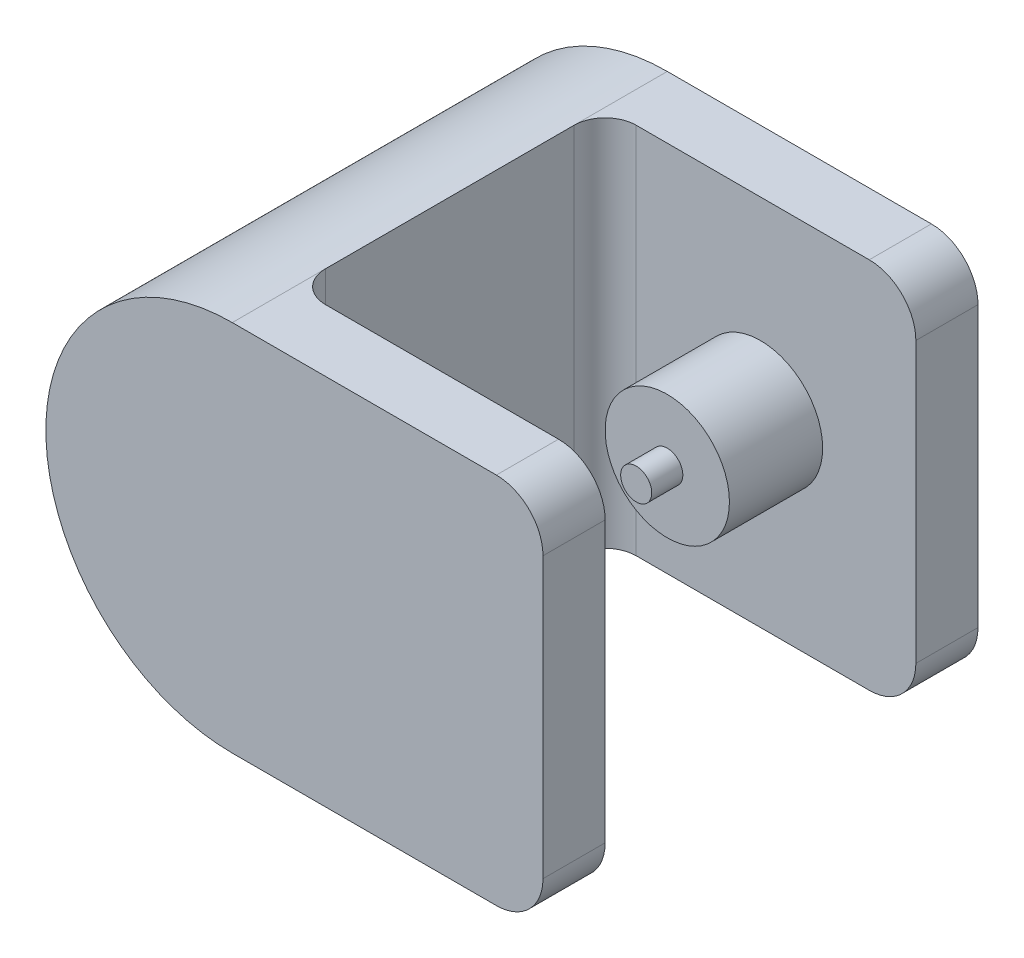
ISO-10303-21;
HEADER;
FILE_DESCRIPTION(('STEP AP214'),'2;1');
FILE_NAME('part.step','',(''),(''),'','','');
FILE_SCHEMA(('AUTOMOTIVE_DESIGN { 1 0 10303 214 1 1 1 1 }'));
ENDSEC;
DATA;
#1=APPLICATION_CONTEXT('core data for automotive mechanical design processes');
#2=APPLICATION_PROTOCOL_DEFINITION('international standard','automotive_design',2000,#1);
#3=PRODUCT_CONTEXT('',#1,'mechanical');
#4=PRODUCT('Part','Part','',(#3));
#5=PRODUCT_RELATED_PRODUCT_CATEGORY('part','',(#4));
#6=PRODUCT_DEFINITION_FORMATION('','',#4);
#7=PRODUCT_DEFINITION_CONTEXT('part definition',#1,'design');
#8=PRODUCT_DEFINITION('design','',#6,#7);
#9=PRODUCT_DEFINITION_SHAPE('','',#8);
#10=(LENGTH_UNIT() NAMED_UNIT(*) SI_UNIT(.MILLI.,.METRE.));
#11=(NAMED_UNIT(*) PLANE_ANGLE_UNIT() SI_UNIT($,.RADIAN.));
#12=(NAMED_UNIT(*) SI_UNIT($,.STERADIAN.) SOLID_ANGLE_UNIT());
#13=UNCERTAINTY_MEASURE_WITH_UNIT(LENGTH_MEASURE(1.E-05),#10,'distance_accuracy_value','');
#14=(GEOMETRIC_REPRESENTATION_CONTEXT(3) GLOBAL_UNCERTAINTY_ASSIGNED_CONTEXT((#13)) GLOBAL_UNIT_ASSIGNED_CONTEXT((#10,
#11,#12)) REPRESENTATION_CONTEXT('',''));
#15=CARTESIAN_POINT('',(0.,0.,0.));
#16=DIRECTION('',(0.,0.,1.));
#17=DIRECTION('',(1.,0.,0.));
#18=AXIS2_PLACEMENT_3D('',#15,#16,#17);
#19=CARTESIAN_POINT('',(0.,-60.,20.));
#20=DIRECTION('',(0.,1.,0.));
#21=DIRECTION('',(0.,0.,1.));
#22=AXIS2_PLACEMENT_3D('',#19,#20,#21);
#23=PLANE('',#22);
#24=DIRECTION('',(1.,0.,0.));
#25=VECTOR('',#24,1.);
#26=CARTESIAN_POINT('',(0.,-60.,0.));
#27=LINE('',#26,#25);
#28=CARTESIAN_POINT('',(-50.,-60.,0.));
#29=VERTEX_POINT('',#28);
#30=CARTESIAN_POINT('',(35.,-60.,0.));
#31=VERTEX_POINT('',#30);
#32=EDGE_CURVE('E177',#29,#31,#27,.T.);
#33=ORIENTED_EDGE('',*,*,#32,.T.);
#34=DIRECTION('',(0.,0.,-1.));
#35=VECTOR('',#34,1.);
#36=CARTESIAN_POINT('',(35.,-60.,20.));
#37=LINE('',#36,#35);
#38=CARTESIAN_POINT('',(35.,-60.,20.));
#39=VERTEX_POINT('',#38);
#40=EDGE_CURVE('E43',#31,#39,#37,.F.);
#41=ORIENTED_EDGE('',*,*,#40,.T.);
#42=DIRECTION('',(1.,0.,0.));
#43=VECTOR('',#42,1.);
#44=CARTESIAN_POINT('',(0.,-60.,20.));
#45=LINE('',#44,#43);
#46=CARTESIAN_POINT('',(-40.,-60.,20.));
#47=VERTEX_POINT('',#46);
#48=EDGE_CURVE('E178',#47,#39,#45,.T.);
#49=ORIENTED_EDGE('',*,*,#48,.F.);
#50=CARTESIAN_POINT('',(-40.,-60.,30.));
#51=DIRECTION('',(0.,1.,0.));
#52=DIRECTION('',(0.,0.,1.));
#53=AXIS2_PLACEMENT_3D('',#50,#51,#52);
#54=CIRCLE('',#53,10.);
#55=CARTESIAN_POINT('',(-50.,-60.,30.));
#56=VERTEX_POINT('',#55);
#57=EDGE_CURVE('E209',#47,#56,#54,.T.);
#58=ORIENTED_EDGE('',*,*,#57,.T.);
#59=DIRECTION('',(0.,0.,-1.));
#60=VECTOR('',#59,1.);
#61=CARTESIAN_POINT('',(-50.,-60.,20.));
#62=LINE('',#61,#60);
#63=EDGE_CURVE('E186',#56,#29,#62,.T.);
#64=ORIENTED_EDGE('',*,*,#63,.T.);
#65=EDGE_LOOP('',(#33,#41,#49,#58,#64));
#66=FACE_BOUND('',#65,.T.);
#67=ADVANCED_FACE('F35',(#66),#23,.F.);
#68=CARTESIAN_POINT('',(50.,0.,20.));
#69=DIRECTION('',(-1.,0.,0.));
#70=DIRECTION('',(0.,0.,1.));
#71=AXIS2_PLACEMENT_3D('',#68,#69,#70);
#72=PLANE('',#71);
#73=DIRECTION('',(0.,1.,0.));
#74=VECTOR('',#73,1.);
#75=CARTESIAN_POINT('',(50.,0.,0.));
#76=LINE('',#75,#74);
#77=CARTESIAN_POINT('',(50.,-45.,0.));
#78=VERTEX_POINT('',#77);
#79=CARTESIAN_POINT('',(50.,45.,0.));
#80=VERTEX_POINT('',#79);
#81=EDGE_CURVE('E188',#78,#80,#76,.T.);
#82=ORIENTED_EDGE('',*,*,#81,.T.);
#83=DIRECTION('',(0.,0.,-1.));
#84=VECTOR('',#83,1.);
#85=CARTESIAN_POINT('',(50.,45.,20.));
#86=LINE('',#85,#84);
#87=CARTESIAN_POINT('',(50.,45.,20.));
#88=VERTEX_POINT('',#87);
#89=EDGE_CURVE('E57',#80,#88,#86,.F.);
#90=ORIENTED_EDGE('',*,*,#89,.T.);
#91=DIRECTION('',(0.,1.,0.));
#92=VECTOR('',#91,1.);
#93=CARTESIAN_POINT('',(50.,0.,20.));
#94=LINE('',#93,#92);
#95=CARTESIAN_POINT('',(50.,-45.,20.));
#96=VERTEX_POINT('',#95);
#97=EDGE_CURVE('E180',#96,#88,#94,.T.);
#98=ORIENTED_EDGE('',*,*,#97,.F.);
#99=DIRECTION('',(0.,0.,-1.));
#100=VECTOR('',#99,1.);
#101=CARTESIAN_POINT('',(50.,-45.,20.));
#102=LINE('',#101,#100);
#103=EDGE_CURVE('E241',#96,#78,#102,.T.);
#104=ORIENTED_EDGE('',*,*,#103,.T.);
#105=EDGE_LOOP('',(#82,#90,#98,#104));
#106=FACE_BOUND('',#105,.T.);
#107=ADVANCED_FACE('F263',(#106),#72,.F.);
#108=CARTESIAN_POINT('',(0.,60.,20.));
#109=DIRECTION('',(0.,1.,0.));
#110=DIRECTION('',(0.,0.,1.));
#111=AXIS2_PLACEMENT_3D('',#108,#109,#110);
#112=PLANE('',#111);
#113=DIRECTION('',(1.,0.,0.));
#114=VECTOR('',#113,1.);
#115=CARTESIAN_POINT('',(0.,60.,20.));
#116=LINE('',#115,#114);
#117=CARTESIAN_POINT('',(-40.,60.,20.));
#118=VERTEX_POINT('',#117);
#119=CARTESIAN_POINT('',(35.,60.,20.));
#120=VERTEX_POINT('',#119);
#121=EDGE_CURVE('E183',#118,#120,#116,.T.);
#122=ORIENTED_EDGE('',*,*,#121,.T.);
#123=DIRECTION('',(0.,0.,-1.));
#124=VECTOR('',#123,1.);
#125=CARTESIAN_POINT('',(35.,60.,0.));
#126=LINE('',#125,#124);
#127=CARTESIAN_POINT('',(35.,60.,0.));
#128=VERTEX_POINT('',#127);
#129=EDGE_CURVE('E234',#120,#128,#126,.T.);
#130=ORIENTED_EDGE('',*,*,#129,.T.);
#131=DIRECTION('',(1.,0.,0.));
#132=VECTOR('',#131,1.);
#133=CARTESIAN_POINT('',(0.,60.,0.));
#134=LINE('',#133,#132);
#135=CARTESIAN_POINT('',(-50.,60.,0.));
#136=VERTEX_POINT('',#135);
#137=EDGE_CURVE('E181',#136,#128,#134,.T.);
#138=ORIENTED_EDGE('',*,*,#137,.F.);
#139=DIRECTION('',(0.,0.,-1.));
#140=VECTOR('',#139,1.);
#141=CARTESIAN_POINT('',(-50.,60.,20.));
#142=LINE('',#141,#140);
#143=CARTESIAN_POINT('',(-50.,60.,30.));
#144=VERTEX_POINT('',#143);
#145=EDGE_CURVE('E194',#144,#136,#142,.T.);
#146=ORIENTED_EDGE('',*,*,#145,.F.);
#147=CARTESIAN_POINT('',(-40.,60.,30.));
#148=DIRECTION('',(0.,1.,0.));
#149=DIRECTION('',(0.,0.,1.));
#150=AXIS2_PLACEMENT_3D('',#147,#148,#149);
#151=CIRCLE('',#150,10.);
#152=EDGE_CURVE('E207',#144,#118,#151,.F.);
#153=ORIENTED_EDGE('',*,*,#152,.T.);
#154=EDGE_LOOP('',(#122,#130,#138,#146,#153));
#155=FACE_BOUND('',#154,.T.);
#156=ADVANCED_FACE('F256',(#155),#112,.T.);
#157=CARTESIAN_POINT('',(0.,0.,20.));
#158=DIRECTION('',(0.,0.,1.));
#159=DIRECTION('',(1.,0.,0.));
#160=AXIS2_PLACEMENT_3D('',#157,#158,#159);
#161=PLANE('',#160);
#162=CARTESIAN_POINT('',(0.,0.,20.));
#163=DIRECTION('',(0.,0.,1.));
#164=DIRECTION('',(1.,0.,0.));
#165=AXIS2_PLACEMENT_3D('',#162,#163,#164);
#166=CIRCLE('',#165,20.);
#167=CARTESIAN_POINT('',(20.,0.,20.));
#168=VERTEX_POINT('',#167);
#169=EDGE_CURVE('E290',#168,#168,#166,.T.);
#170=ORIENTED_EDGE('',*,*,#169,.F.);
#171=EDGE_LOOP('',(#170));
#172=FACE_BOUND('',#171,.T.);
#173=ORIENTED_EDGE('',*,*,#97,.T.);
#174=CARTESIAN_POINT('',(35.,45.,20.));
#175=DIRECTION('',(0.,0.,1.));
#176=DIRECTION('',(1.,0.,0.));
#177=AXIS2_PLACEMENT_3D('',#174,#175,#176);
#178=CIRCLE('',#177,15.);
#179=EDGE_CURVE('E247',#88,#120,#178,.T.);
#180=ORIENTED_EDGE('',*,*,#179,.T.);
#181=ORIENTED_EDGE('',*,*,#121,.F.);
#182=DIRECTION('',(0.,1.,0.));
#183=VECTOR('',#182,1.);
#184=CARTESIAN_POINT('',(-40.,0.,20.));
#185=LINE('',#184,#183);
#186=EDGE_CURVE('E202',#118,#47,#185,.F.);
#187=ORIENTED_EDGE('',*,*,#186,.T.);
#188=ORIENTED_EDGE('',*,*,#48,.T.);
#189=CARTESIAN_POINT('',(35.,-45.,20.));
#190=DIRECTION('',(0.,0.,1.));
#191=DIRECTION('',(1.,0.,0.));
#192=AXIS2_PLACEMENT_3D('',#189,#190,#191);
#193=CIRCLE('',#192,15.);
#194=EDGE_CURVE('E245',#39,#96,#193,.T.);
#195=ORIENTED_EDGE('',*,*,#194,.T.);
#196=EDGE_LOOP('',(#173,#180,#181,#187,#188,#195));
#197=FACE_BOUND('',#196,.T.);
#198=ADVANCED_FACE('F251',(#172,#197),#161,.T.);
#199=CARTESIAN_POINT('',(0.,0.,0.));
#200=DIRECTION('',(0.,0.,1.));
#201=DIRECTION('',(1.,0.,0.));
#202=AXIS2_PLACEMENT_3D('',#199,#200,#201);
#203=PLANE('',#202);
#204=ORIENTED_EDGE('',*,*,#137,.T.);
#205=CARTESIAN_POINT('',(35.,45.,0.));
#206=DIRECTION('',(0.,0.,1.));
#207=DIRECTION('',(1.,0.,0.));
#208=AXIS2_PLACEMENT_3D('',#205,#206,#207);
#209=CIRCLE('',#208,15.);
#210=EDGE_CURVE('E239',#128,#80,#209,.F.);
#211=ORIENTED_EDGE('',*,*,#210,.T.);
#212=ORIENTED_EDGE('',*,*,#81,.F.);
#213=CARTESIAN_POINT('',(35.,-45.,0.));
#214=DIRECTION('',(0.,0.,1.));
#215=DIRECTION('',(1.,0.,0.));
#216=AXIS2_PLACEMENT_3D('',#213,#214,#215);
#217=CIRCLE('',#216,15.);
#218=EDGE_CURVE('E237',#78,#31,#217,.F.);
#219=ORIENTED_EDGE('',*,*,#218,.T.);
#220=ORIENTED_EDGE('',*,*,#32,.F.);
#221=CARTESIAN_POINT('',(-50.,0.,0.));
#222=DIRECTION('',(0.,0.,1.));
#223=DIRECTION('',(1.,0.,0.));
#224=AXIS2_PLACEMENT_3D('',#221,#222,#223);
#225=CIRCLE('',#224,60.);
#226=EDGE_CURVE('E166',#136,#29,#225,.T.);
#227=ORIENTED_EDGE('',*,*,#226,.F.);
#228=EDGE_LOOP('',(#204,#211,#212,#219,#220,#227));
#229=FACE_BOUND('',#228,.T.);
#230=ADVANCED_FACE('F262',(#229),#203,.F.);
#231=CARTESIAN_POINT('',(-50.,0.,120.));
#232=DIRECTION('',(-1.,0.,0.));
#233=DIRECTION('',(0.,0.,1.));
#234=AXIS2_PLACEMENT_3D('',#231,#232,#233);
#235=PLANE('',#234);
#236=DIRECTION('',(0.,0.,-1.));
#237=VECTOR('',#236,1.);
#238=CARTESIAN_POINT('',(-50.,-60.,120.));
#239=LINE('',#238,#237);
#240=CARTESIAN_POINT('',(-50.,-60.,110.));
#241=VERTEX_POINT('',#240);
#242=EDGE_CURVE('E164',#241,#56,#239,.T.);
#243=ORIENTED_EDGE('',*,*,#242,.T.);
#244=DIRECTION('',(0.,1.,0.));
#245=VECTOR('',#244,1.);
#246=CARTESIAN_POINT('',(-50.,0.,30.));
#247=LINE('',#246,#245);
#248=EDGE_CURVE('E199',#56,#144,#247,.T.);
#249=ORIENTED_EDGE('',*,*,#248,.T.);
#250=DIRECTION('',(0.,0.,-1.));
#251=VECTOR('',#250,1.);
#252=CARTESIAN_POINT('',(-50.,60.,120.));
#253=LINE('',#252,#251);
#254=CARTESIAN_POINT('',(-50.,60.,110.));
#255=VERTEX_POINT('',#254);
#256=EDGE_CURVE('E174',#255,#144,#253,.T.);
#257=ORIENTED_EDGE('',*,*,#256,.F.);
#258=DIRECTION('',(0.,1.,0.));
#259=VECTOR('',#258,1.);
#260=CARTESIAN_POINT('',(-50.,-60.,110.));
#261=LINE('',#260,#259);
#262=EDGE_CURVE('E197',#255,#241,#261,.F.);
#263=ORIENTED_EDGE('',*,*,#262,.T.);
#264=EDGE_LOOP('',(#243,#249,#257,#263));
#265=FACE_BOUND('',#264,.T.);
#266=ADVANCED_FACE('F271',(#265),#235,.F.);
#267=CARTESIAN_POINT('',(-50.,0.,120.));
#268=DIRECTION('',(0.,0.,-1.));
#269=DIRECTION('',(-1.,0.,0.));
#270=AXIS2_PLACEMENT_3D('',#267,#268,#269);
#271=CYLINDRICAL_SURFACE('',#270,60.);
#272=ORIENTED_EDGE('',*,*,#226,.T.);
#273=ORIENTED_EDGE('',*,*,#63,.F.);
#274=ORIENTED_EDGE('',*,*,#242,.F.);
#275=DIRECTION('',(0.,0.,-1.));
#276=VECTOR('',#275,1.);
#277=CARTESIAN_POINT('',(-50.,-60.,140.));
#278=LINE('',#277,#276);
#279=CARTESIAN_POINT('',(-50.,-60.,140.));
#280=VERTEX_POINT('',#279);
#281=EDGE_CURVE('E143',#280,#241,#278,.T.);
#282=ORIENTED_EDGE('',*,*,#281,.F.);
#283=CARTESIAN_POINT('',(-50.,0.,140.));
#284=DIRECTION('',(0.,0.,1.));
#285=DIRECTION('',(1.,0.,0.));
#286=AXIS2_PLACEMENT_3D('',#283,#284,#285);
#287=CIRCLE('',#286,60.);
#288=CARTESIAN_POINT('',(-50.,60.,140.));
#289=VERTEX_POINT('',#288);
#290=EDGE_CURVE('E150',#289,#280,#287,.T.);
#291=ORIENTED_EDGE('',*,*,#290,.F.);
#292=DIRECTION('',(0.,0.,-1.));
#293=VECTOR('',#292,1.);
#294=CARTESIAN_POINT('',(-50.,60.,140.));
#295=LINE('',#294,#293);
#296=EDGE_CURVE('E167',#289,#255,#295,.T.);
#297=ORIENTED_EDGE('',*,*,#296,.T.);
#298=ORIENTED_EDGE('',*,*,#256,.T.);
#299=ORIENTED_EDGE('',*,*,#145,.T.);
#300=EDGE_LOOP('',(#272,#273,#274,#282,#291,#297,#298,#299));
#301=FACE_BOUND('',#300,.T.);
#302=ADVANCED_FACE('F162',(#301),#271,.T.);
#303=CARTESIAN_POINT('',(-50.,0.,120.));
#304=DIRECTION('',(0.,0.,1.));
#305=DIRECTION('',(1.,0.,0.));
#306=AXIS2_PLACEMENT_3D('',#303,#304,#305);
#307=PLANE('',#306);
#308=CARTESIAN_POINT('',(0.,0.,120.));
#309=DIRECTION('',(0.,0.,1.));
#310=DIRECTION('',(1.,0.,0.));
#311=AXIS2_PLACEMENT_3D('',#308,#309,#310);
#312=CIRCLE('',#311,20.);
#313=CARTESIAN_POINT('',(20.,0.,120.));
#314=VERTEX_POINT('',#313);
#315=EDGE_CURVE('E11',#314,#314,#312,.F.);
#316=ORIENTED_EDGE('',*,*,#315,.F.);
#317=EDGE_LOOP('',(#316));
#318=FACE_BOUND('',#317,.T.);
#319=DIRECTION('',(-1.,0.,0.));
#320=VECTOR('',#319,1.);
#321=CARTESIAN_POINT('',(50.,60.,120.));
#322=LINE('',#321,#320);
#323=CARTESIAN_POINT('',(35.,60.,120.));
#324=VERTEX_POINT('',#323);
#325=CARTESIAN_POINT('',(-40.,60.,120.));
#326=VERTEX_POINT('',#325);
#327=EDGE_CURVE('E159',#324,#326,#322,.T.);
#328=ORIENTED_EDGE('',*,*,#327,.F.);
#329=CARTESIAN_POINT('',(35.,45.,120.));
#330=DIRECTION('',(0.,0.,1.));
#331=DIRECTION('',(1.,0.,0.));
#332=AXIS2_PLACEMENT_3D('',#329,#330,#331);
#333=CIRCLE('',#332,15.);
#334=CARTESIAN_POINT('',(50.,45.,120.));
#335=VERTEX_POINT('',#334);
#336=EDGE_CURVE('E222',#324,#335,#333,.F.);
#337=ORIENTED_EDGE('',*,*,#336,.T.);
#338=DIRECTION('',(0.,1.,0.));
#339=VECTOR('',#338,1.);
#340=CARTESIAN_POINT('',(50.,-60.,120.));
#341=LINE('',#340,#339);
#342=CARTESIAN_POINT('',(50.,-45.,120.));
#343=VERTEX_POINT('',#342);
#344=EDGE_CURVE('E284',#343,#335,#341,.T.);
#345=ORIENTED_EDGE('',*,*,#344,.F.);
#346=CARTESIAN_POINT('',(35.,-45.,120.));
#347=DIRECTION('',(0.,0.,1.));
#348=DIRECTION('',(1.,0.,0.));
#349=AXIS2_PLACEMENT_3D('',#346,#347,#348);
#350=CIRCLE('',#349,15.);
#351=CARTESIAN_POINT('',(35.,-60.,120.));
#352=VERTEX_POINT('',#351);
#353=EDGE_CURVE('E220',#343,#352,#350,.F.);
#354=ORIENTED_EDGE('',*,*,#353,.T.);
#355=DIRECTION('',(1.,0.,0.));
#356=VECTOR('',#355,1.);
#357=CARTESIAN_POINT('',(-50.,-60.,120.));
#358=LINE('',#357,#356);
#359=CARTESIAN_POINT('',(-40.,-60.,120.));
#360=VERTEX_POINT('',#359);
#361=EDGE_CURVE('E279',#360,#352,#358,.T.);
#362=ORIENTED_EDGE('',*,*,#361,.F.);
#363=DIRECTION('',(0.,1.,0.));
#364=VECTOR('',#363,1.);
#365=CARTESIAN_POINT('',(-40.,60.,120.));
#366=LINE('',#365,#364);
#367=EDGE_CURVE('E204',#360,#326,#366,.T.);
#368=ORIENTED_EDGE('',*,*,#367,.T.);
#369=EDGE_LOOP('',(#328,#337,#345,#354,#362,#368));
#370=FACE_BOUND('',#369,.T.);
#371=ADVANCED_FACE('F282',(#318,#370),#307,.F.);
#372=CARTESIAN_POINT('',(-50.,-60.,140.));
#373=DIRECTION('',(0.,1.,0.));
#374=DIRECTION('',(0.,0.,1.));
#375=AXIS2_PLACEMENT_3D('',#372,#373,#374);
#376=PLANE('',#375);
#377=ORIENTED_EDGE('',*,*,#361,.T.);
#378=DIRECTION('',(0.,0.,-1.));
#379=VECTOR('',#378,1.);
#380=CARTESIAN_POINT('',(35.,-60.,140.));
#381=LINE('',#380,#379);
#382=CARTESIAN_POINT('',(35.,-60.,140.));
#383=VERTEX_POINT('',#382);
#384=EDGE_CURVE('E146',#352,#383,#381,.F.);
#385=ORIENTED_EDGE('',*,*,#384,.T.);
#386=DIRECTION('',(1.,0.,0.));
#387=VECTOR('',#386,1.);
#388=CARTESIAN_POINT('',(-50.,-60.,140.));
#389=LINE('',#388,#387);
#390=EDGE_CURVE('E138',#280,#383,#389,.T.);
#391=ORIENTED_EDGE('',*,*,#390,.F.);
#392=ORIENTED_EDGE('',*,*,#281,.T.);
#393=CARTESIAN_POINT('',(-40.,-60.,110.));
#394=DIRECTION('',(0.,1.,0.));
#395=DIRECTION('',(0.,0.,1.));
#396=AXIS2_PLACEMENT_3D('',#393,#394,#395);
#397=CIRCLE('',#396,10.);
#398=EDGE_CURVE('E215',#241,#360,#397,.T.);
#399=ORIENTED_EDGE('',*,*,#398,.T.);
#400=EDGE_LOOP('',(#377,#385,#391,#392,#399));
#401=FACE_BOUND('',#400,.T.);
#402=ADVANCED_FACE('F141',(#401),#376,.F.);
#403=CARTESIAN_POINT('',(50.,-60.,140.));
#404=DIRECTION('',(-1.,0.,0.));
#405=DIRECTION('',(0.,0.,1.));
#406=AXIS2_PLACEMENT_3D('',#403,#404,#405);
#407=PLANE('',#406);
#408=ORIENTED_EDGE('',*,*,#344,.T.);
#409=DIRECTION('',(0.,0.,-1.));
#410=VECTOR('',#409,1.);
#411=CARTESIAN_POINT('',(50.,45.,140.));
#412=LINE('',#411,#410);
#413=CARTESIAN_POINT('',(50.,45.,140.));
#414=VERTEX_POINT('',#413);
#415=EDGE_CURVE('E227',#335,#414,#412,.F.);
#416=ORIENTED_EDGE('',*,*,#415,.T.);
#417=DIRECTION('',(0.,1.,0.));
#418=VECTOR('',#417,1.);
#419=CARTESIAN_POINT('',(50.,-60.,140.));
#420=LINE('',#419,#418);
#421=CARTESIAN_POINT('',(50.,-45.,140.));
#422=VERTEX_POINT('',#421);
#423=EDGE_CURVE('E149',#422,#414,#420,.T.);
#424=ORIENTED_EDGE('',*,*,#423,.F.);
#425=DIRECTION('',(0.,0.,-1.));
#426=VECTOR('',#425,1.);
#427=CARTESIAN_POINT('',(50.,-45.,140.));
#428=LINE('',#427,#426);
#429=EDGE_CURVE('E224',#422,#343,#428,.T.);
#430=ORIENTED_EDGE('',*,*,#429,.T.);
#431=EDGE_LOOP('',(#408,#416,#424,#430));
#432=FACE_BOUND('',#431,.T.);
#433=ADVANCED_FACE('F300',(#432),#407,.F.);
#434=CARTESIAN_POINT('',(50.,60.,140.));
#435=DIRECTION('',(0.,-1.,0.));
#436=DIRECTION('',(0.,0.,-1.));
#437=AXIS2_PLACEMENT_3D('',#434,#435,#436);
#438=PLANE('',#437);
#439=DIRECTION('',(-1.,0.,0.));
#440=VECTOR('',#439,1.);
#441=CARTESIAN_POINT('',(50.,60.,140.));
#442=LINE('',#441,#440);
#443=CARTESIAN_POINT('',(35.,60.,140.));
#444=VERTEX_POINT('',#443);
#445=EDGE_CURVE('E156',#444,#289,#442,.T.);
#446=ORIENTED_EDGE('',*,*,#445,.F.);
#447=DIRECTION('',(0.,0.,-1.));
#448=VECTOR('',#447,1.);
#449=CARTESIAN_POINT('',(35.,60.,140.));
#450=LINE('',#449,#448);
#451=EDGE_CURVE('E217',#444,#324,#450,.T.);
#452=ORIENTED_EDGE('',*,*,#451,.T.);
#453=ORIENTED_EDGE('',*,*,#327,.T.);
#454=CARTESIAN_POINT('',(-40.,60.,110.));
#455=DIRECTION('',(0.,-1.,0.));
#456=DIRECTION('',(0.,0.,-1.));
#457=AXIS2_PLACEMENT_3D('',#454,#455,#456);
#458=CIRCLE('',#457,10.);
#459=EDGE_CURVE('E212',#326,#255,#458,.T.);
#460=ORIENTED_EDGE('',*,*,#459,.T.);
#461=ORIENTED_EDGE('',*,*,#296,.F.);
#462=EDGE_LOOP('',(#446,#452,#453,#460,#461));
#463=FACE_BOUND('',#462,.T.);
#464=ADVANCED_FACE('F295',(#463),#438,.F.);
#465=CARTESIAN_POINT('',(-50.,0.,140.));
#466=DIRECTION('',(0.,0.,1.));
#467=DIRECTION('',(1.,0.,0.));
#468=AXIS2_PLACEMENT_3D('',#465,#466,#467);
#469=PLANE('',#468);
#470=ORIENTED_EDGE('',*,*,#423,.T.);
#471=CARTESIAN_POINT('',(35.,45.,140.));
#472=DIRECTION('',(0.,0.,1.));
#473=DIRECTION('',(1.,0.,0.));
#474=AXIS2_PLACEMENT_3D('',#471,#472,#473);
#475=CIRCLE('',#474,15.);
#476=EDGE_CURVE('E231',#414,#444,#475,.T.);
#477=ORIENTED_EDGE('',*,*,#476,.T.);
#478=ORIENTED_EDGE('',*,*,#445,.T.);
#479=ORIENTED_EDGE('',*,*,#290,.T.);
#480=ORIENTED_EDGE('',*,*,#390,.T.);
#481=CARTESIAN_POINT('',(35.,-45.,140.));
#482=DIRECTION('',(0.,0.,1.));
#483=DIRECTION('',(1.,0.,0.));
#484=AXIS2_PLACEMENT_3D('',#481,#482,#483);
#485=CIRCLE('',#484,15.);
#486=EDGE_CURVE('E229',#383,#422,#485,.T.);
#487=ORIENTED_EDGE('',*,*,#486,.T.);
#488=EDGE_LOOP('',(#470,#477,#478,#479,#480,#487));
#489=FACE_BOUND('',#488,.T.);
#490=ADVANCED_FACE('F154',(#489),#469,.T.);
#491=CARTESIAN_POINT('',(-40.,0.,30.));
#492=DIRECTION('',(0.,1.,0.));
#493=DIRECTION('',(0.,0.,1.));
#494=AXIS2_PLACEMENT_3D('',#491,#492,#493);
#495=CYLINDRICAL_SURFACE('',#494,10.);
#496=ORIENTED_EDGE('',*,*,#57,.F.);
#497=ORIENTED_EDGE('',*,*,#186,.F.);
#498=ORIENTED_EDGE('',*,*,#152,.F.);
#499=ORIENTED_EDGE('',*,*,#248,.F.);
#500=EDGE_LOOP('',(#496,#497,#498,#499));
#501=FACE_BOUND('',#500,.T.);
#502=ADVANCED_FACE('F363',(#501),#495,.F.);
#503=CARTESIAN_POINT('',(-40.,0.,110.));
#504=DIRECTION('',(0.,-1.,0.));
#505=DIRECTION('',(0.,0.,-1.));
#506=AXIS2_PLACEMENT_3D('',#503,#504,#505);
#507=CYLINDRICAL_SURFACE('',#506,10.);
#508=ORIENTED_EDGE('',*,*,#398,.F.);
#509=ORIENTED_EDGE('',*,*,#262,.F.);
#510=ORIENTED_EDGE('',*,*,#459,.F.);
#511=ORIENTED_EDGE('',*,*,#367,.F.);
#512=EDGE_LOOP('',(#508,#509,#510,#511));
#513=FACE_BOUND('',#512,.T.);
#514=ADVANCED_FACE('F276',(#513),#507,.F.);
#515=CARTESIAN_POINT('',(35.,45.,140.));
#516=DIRECTION('',(0.,0.,-1.));
#517=DIRECTION('',(-1.,0.,0.));
#518=AXIS2_PLACEMENT_3D('',#515,#516,#517);
#519=CYLINDRICAL_SURFACE('',#518,15.);
#520=ORIENTED_EDGE('',*,*,#476,.F.);
#521=ORIENTED_EDGE('',*,*,#415,.F.);
#522=ORIENTED_EDGE('',*,*,#336,.F.);
#523=ORIENTED_EDGE('',*,*,#451,.F.);
#524=EDGE_LOOP('',(#520,#521,#522,#523));
#525=FACE_BOUND('',#524,.T.);
#526=ADVANCED_FACE('F304',(#525),#519,.T.);
#527=CARTESIAN_POINT('',(35.,-45.,140.));
#528=DIRECTION('',(0.,0.,-1.));
#529=DIRECTION('',(-1.,0.,0.));
#530=AXIS2_PLACEMENT_3D('',#527,#528,#529);
#531=CYLINDRICAL_SURFACE('',#530,15.);
#532=ORIENTED_EDGE('',*,*,#486,.F.);
#533=ORIENTED_EDGE('',*,*,#384,.F.);
#534=ORIENTED_EDGE('',*,*,#353,.F.);
#535=ORIENTED_EDGE('',*,*,#429,.F.);
#536=EDGE_LOOP('',(#532,#533,#534,#535));
#537=FACE_BOUND('',#536,.T.);
#538=ADVANCED_FACE('F371',(#537),#531,.T.);
#539=CARTESIAN_POINT('',(35.,45.,20.));
#540=DIRECTION('',(0.,0.,1.));
#541=DIRECTION('',(1.,0.,0.));
#542=AXIS2_PLACEMENT_3D('',#539,#540,#541);
#543=CYLINDRICAL_SURFACE('',#542,15.);
#544=ORIENTED_EDGE('',*,*,#179,.F.);
#545=ORIENTED_EDGE('',*,*,#89,.F.);
#546=ORIENTED_EDGE('',*,*,#210,.F.);
#547=ORIENTED_EDGE('',*,*,#129,.F.);
#548=EDGE_LOOP('',(#544,#545,#546,#547));
#549=FACE_BOUND('',#548,.T.);
#550=ADVANCED_FACE('F259',(#549),#543,.T.);
#551=CARTESIAN_POINT('',(35.,-45.,20.));
#552=DIRECTION('',(0.,0.,-1.));
#553=DIRECTION('',(-1.,0.,0.));
#554=AXIS2_PLACEMENT_3D('',#551,#552,#553);
#555=CYLINDRICAL_SURFACE('',#554,15.);
#556=ORIENTED_EDGE('',*,*,#194,.F.);
#557=ORIENTED_EDGE('',*,*,#40,.F.);
#558=ORIENTED_EDGE('',*,*,#218,.F.);
#559=ORIENTED_EDGE('',*,*,#103,.F.);
#560=EDGE_LOOP('',(#556,#557,#558,#559));
#561=FACE_BOUND('',#560,.T.);
#562=ADVANCED_FACE('F37',(#561),#555,.T.);
#563=CARTESIAN_POINT('',(0.,0.,50.));
#564=DIRECTION('',(0.,0.,-1.));
#565=DIRECTION('',(-1.,0.,0.));
#566=AXIS2_PLACEMENT_3D('',#563,#564,#565);
#567=CYLINDRICAL_SURFACE('',#566,20.);
#568=CARTESIAN_POINT('',(0.,0.,50.));
#569=DIRECTION('',(0.,0.,1.));
#570=DIRECTION('',(1.,0.,0.));
#571=AXIS2_PLACEMENT_3D('',#568,#569,#570);
#572=CIRCLE('',#571,20.);
#573=CARTESIAN_POINT('',(20.,0.,50.));
#574=VERTEX_POINT('',#573);
#575=EDGE_CURVE('E285',#574,#574,#572,.T.);
#576=ORIENTED_EDGE('',*,*,#575,.F.);
#577=EDGE_LOOP('',(#576));
#578=FACE_BOUND('',#577,.T.);
#579=ORIENTED_EDGE('',*,*,#169,.T.);
#580=EDGE_LOOP('',(#579));
#581=FACE_BOUND('',#580,.T.);
#582=ADVANCED_FACE('F378',(#578,#581),#567,.T.);
#583=CARTESIAN_POINT('',(0.,0.,50.));
#584=DIRECTION('',(0.,0.,1.));
#585=DIRECTION('',(1.,0.,0.));
#586=AXIS2_PLACEMENT_3D('',#583,#584,#585);
#587=PLANE('',#586);
#588=CARTESIAN_POINT('',(0.,0.,50.));
#589=DIRECTION('',(0.,0.,1.));
#590=DIRECTION('',(1.,0.,0.));
#591=AXIS2_PLACEMENT_3D('',#588,#589,#590);
#592=CIRCLE('',#591,5.);
#593=CARTESIAN_POINT('',(5.,0.,50.));
#594=VERTEX_POINT('',#593);
#595=EDGE_CURVE('E309',#594,#594,#592,.T.);
#596=ORIENTED_EDGE('',*,*,#595,.F.);
#597=EDGE_LOOP('',(#596));
#598=FACE_BOUND('',#597,.T.);
#599=ORIENTED_EDGE('',*,*,#575,.T.);
#600=EDGE_LOOP('',(#599));
#601=FACE_BOUND('',#600,.T.);
#602=ADVANCED_FACE('F382',(#598,#601),#587,.T.);
#603=CARTESIAN_POINT('',(0.,0.,60.));
#604=DIRECTION('',(0.,0.,-1.));
#605=DIRECTION('',(-1.,0.,0.));
#606=AXIS2_PLACEMENT_3D('',#603,#604,#605);
#607=CYLINDRICAL_SURFACE('',#606,5.);
#608=CARTESIAN_POINT('',(0.,0.,60.));
#609=DIRECTION('',(0.,0.,1.));
#610=DIRECTION('',(1.,0.,0.));
#611=AXIS2_PLACEMENT_3D('',#608,#609,#610);
#612=CIRCLE('',#611,5.);
#613=CARTESIAN_POINT('',(5.,0.,60.));
#614=VERTEX_POINT('',#613);
#615=EDGE_CURVE('E307',#614,#614,#612,.T.);
#616=ORIENTED_EDGE('',*,*,#615,.F.);
#617=EDGE_LOOP('',(#616));
#618=FACE_BOUND('',#617,.T.);
#619=ORIENTED_EDGE('',*,*,#595,.T.);
#620=EDGE_LOOP('',(#619));
#621=FACE_BOUND('',#620,.T.);
#622=ADVANCED_FACE('F388',(#618,#621),#607,.T.);
#623=CARTESIAN_POINT('',(0.,0.,60.));
#624=DIRECTION('',(0.,0.,1.));
#625=DIRECTION('',(1.,0.,0.));
#626=AXIS2_PLACEMENT_3D('',#623,#624,#625);
#627=PLANE('',#626);
#628=ORIENTED_EDGE('',*,*,#615,.T.);
#629=EDGE_LOOP('',(#628));
#630=FACE_BOUND('',#629,.T.);
#631=ADVANCED_FACE('F341',(#630),#627,.T.);
#632=CARTESIAN_POINT('',(0.,0.,90.));
#633=DIRECTION('',(0.,0.,1.));
#634=DIRECTION('',(0.,-1.,0.));
#635=AXIS2_PLACEMENT_3D('',#632,#633,#634);
#636=CYLINDRICAL_SURFACE('',#635,20.);
#637=CARTESIAN_POINT('',(0.,0.,90.));
#638=DIRECTION('',(0.,0.,-1.));
#639=DIRECTION('',(0.,1.,0.));
#640=AXIS2_PLACEMENT_3D('',#637,#638,#639);
#641=CIRCLE('',#640,20.);
#642=CARTESIAN_POINT('',(0.,20.,90.));
#643=VERTEX_POINT('',#642);
#644=EDGE_CURVE('E312',#643,#643,#641,.T.);
#645=ORIENTED_EDGE('',*,*,#644,.F.);
#646=EDGE_LOOP('',(#645));
#647=FACE_BOUND('',#646,.T.);
#648=ORIENTED_EDGE('',*,*,#315,.T.);
#649=EDGE_LOOP('',(#648));
#650=FACE_BOUND('',#649,.T.);
#651=ADVANCED_FACE('F335',(#647,#650),#636,.T.);
#652=CARTESIAN_POINT('',(0.,0.,90.));
#653=DIRECTION('',(0.,0.,-1.));
#654=DIRECTION('',(0.,1.,0.));
#655=AXIS2_PLACEMENT_3D('',#652,#653,#654);
#656=PLANE('',#655);
#657=CARTESIAN_POINT('',(0.,0.,90.));
#658=DIRECTION('',(0.,0.,-1.));
#659=DIRECTION('',(0.,1.,0.));
#660=AXIS2_PLACEMENT_3D('',#657,#658,#659);
#661=CIRCLE('',#660,5.);
#662=CARTESIAN_POINT('',(0.,5.00000000000001,90.));
#663=VERTEX_POINT('',#662);
#664=EDGE_CURVE('E318',#663,#663,#661,.T.);
#665=ORIENTED_EDGE('',*,*,#664,.F.);
#666=EDGE_LOOP('',(#665));
#667=FACE_BOUND('',#666,.T.);
#668=ORIENTED_EDGE('',*,*,#644,.T.);
#669=EDGE_LOOP('',(#668));
#670=FACE_BOUND('',#669,.T.);
#671=ADVANCED_FACE('F329',(#667,#670),#656,.T.);
#672=CARTESIAN_POINT('',(0.,0.,80.));
#673=DIRECTION('',(0.,0.,1.));
#674=DIRECTION('',(0.,-1.,0.));
#675=AXIS2_PLACEMENT_3D('',#672,#673,#674);
#676=CYLINDRICAL_SURFACE('',#675,5.);
#677=CARTESIAN_POINT('',(0.,0.,80.));
#678=DIRECTION('',(0.,0.,-1.));
#679=DIRECTION('',(0.,1.,0.));
#680=AXIS2_PLACEMENT_3D('',#677,#678,#679);
#681=CIRCLE('',#680,5.);
#682=CARTESIAN_POINT('',(0.,5.00000000000001,80.));
#683=VERTEX_POINT('',#682);
#684=EDGE_CURVE('E317',#683,#683,#681,.T.);
#685=ORIENTED_EDGE('',*,*,#684,.F.);
#686=EDGE_LOOP('',(#685));
#687=FACE_BOUND('',#686,.T.);
#688=ORIENTED_EDGE('',*,*,#664,.T.);
#689=EDGE_LOOP('',(#688));
#690=FACE_BOUND('',#689,.T.);
#691=ADVANCED_FACE('F326',(#687,#690),#676,.T.);
#692=CARTESIAN_POINT('',(0.,0.,80.));
#693=DIRECTION('',(0.,0.,-1.));
#694=DIRECTION('',(0.,1.,0.));
#695=AXIS2_PLACEMENT_3D('',#692,#693,#694);
#696=PLANE('',#695);
#697=ORIENTED_EDGE('',*,*,#684,.T.);
#698=EDGE_LOOP('',(#697));
#699=FACE_BOUND('',#698,.T.);
#700=ADVANCED_FACE('F324',(#699),#696,.T.);
#701=CLOSED_SHELL('',(#67,#107,#156,#198,#230,#266,#302,#371,#402,#433,#464,#490,#502,#514,#526,
#538,#550,#562,#582,#602,#622,#631,#651,#671,#691,#700));
#702=MANIFOLD_SOLID_BREP('B2',#701);
#703=ADVANCED_BREP_SHAPE_REPRESENTATION('',(#18,#702),#14);
#704=SHAPE_DEFINITION_REPRESENTATION(#9,#703);
ENDSEC;
END-ISO-10303-21;
